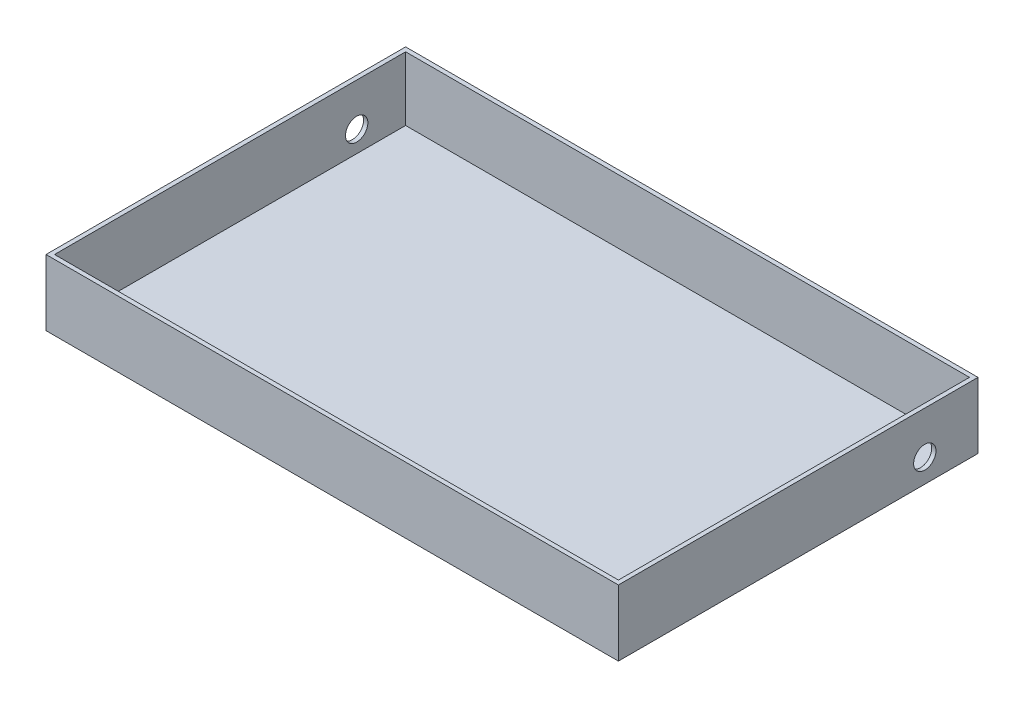
ISO-10303-21;
HEADER;
FILE_DESCRIPTION(('STEP AP214'),'2;1');
FILE_NAME('part.step','',(''),(''),'','','');
FILE_SCHEMA(('AUTOMOTIVE_DESIGN { 1 0 10303 214 1 1 1 1 }'));
ENDSEC;
DATA;
#1=APPLICATION_CONTEXT('core data for automotive mechanical design processes');
#2=APPLICATION_PROTOCOL_DEFINITION('international standard','automotive_design',2000,#1);
#3=PRODUCT_CONTEXT('',#1,'mechanical');
#4=PRODUCT('Part','Part','',(#3));
#5=PRODUCT_RELATED_PRODUCT_CATEGORY('part','',(#4));
#6=PRODUCT_DEFINITION_FORMATION('','',#4);
#7=PRODUCT_DEFINITION_CONTEXT('part definition',#1,'design');
#8=PRODUCT_DEFINITION('design','',#6,#7);
#9=PRODUCT_DEFINITION_SHAPE('','',#8);
#10=(LENGTH_UNIT() NAMED_UNIT(*) SI_UNIT(.MILLI.,.METRE.));
#11=(NAMED_UNIT(*) PLANE_ANGLE_UNIT() SI_UNIT($,.RADIAN.));
#12=(NAMED_UNIT(*) SI_UNIT($,.STERADIAN.) SOLID_ANGLE_UNIT());
#13=UNCERTAINTY_MEASURE_WITH_UNIT(LENGTH_MEASURE(1.E-05),#10,'distance_accuracy_value','');
#14=(GEOMETRIC_REPRESENTATION_CONTEXT(3) GLOBAL_UNCERTAINTY_ASSIGNED_CONTEXT((#13)) GLOBAL_UNIT_ASSIGNED_CONTEXT((#10,
#11,#12)) REPRESENTATION_CONTEXT('',''));
#15=CARTESIAN_POINT('',(0.,0.,0.));
#16=DIRECTION('',(0.,0.,1.));
#17=DIRECTION('',(1.,0.,0.));
#18=AXIS2_PLACEMENT_3D('',#15,#16,#17);
#19=CARTESIAN_POINT('',(0.,30.,0.));
#20=DIRECTION('',(0.,1.,0.));
#21=DIRECTION('',(0.,0.,1.));
#22=AXIS2_PLACEMENT_3D('',#19,#20,#21);
#23=PLANE('',#22);
#24=DIRECTION('',(0.,0.,1.));
#25=VECTOR('',#24,1.);
#26=CARTESIAN_POINT('',(-70.4938729141216,30.,-48.7957647058824));
#27=LINE('',#26,#25);
#28=CARTESIAN_POINT('',(-70.4938729141216,30.,-48.7957647058824));
#29=VERTEX_POINT('',#28);
#30=CARTESIAN_POINT('',(-70.4938729141216,30.,120.204235294118));
#31=VERTEX_POINT('',#30);
#32=EDGE_CURVE('E165',#29,#31,#27,.T.);
#33=ORIENTED_EDGE('',*,*,#32,.T.);
#34=DIRECTION('',(1.,0.,0.));
#35=VECTOR('',#34,1.);
#36=CARTESIAN_POINT('',(-70.4938729141216,30.,120.204235294118));
#37=LINE('',#36,#35);
#38=CARTESIAN_POINT('',(198.506127085878,30.,120.204235294118));
#39=VERTEX_POINT('',#38);
#40=EDGE_CURVE('E167',#31,#39,#37,.T.);
#41=ORIENTED_EDGE('',*,*,#40,.T.);
#42=DIRECTION('',(0.,0.,-1.));
#43=VECTOR('',#42,1.);
#44=CARTESIAN_POINT('',(198.506127085878,30.,-48.7957647058824));
#45=LINE('',#44,#43);
#46=CARTESIAN_POINT('',(198.506127085878,30.,-48.7957647058824));
#47=VERTEX_POINT('',#46);
#48=EDGE_CURVE('E169',#39,#47,#45,.T.);
#49=ORIENTED_EDGE('',*,*,#48,.T.);
#50=DIRECTION('',(-1.,0.,0.));
#51=VECTOR('',#50,1.);
#52=CARTESIAN_POINT('',(-70.4938729141216,30.,-48.7957647058824));
#53=LINE('',#52,#51);
#54=EDGE_CURVE('E63',#47,#29,#53,.T.);
#55=ORIENTED_EDGE('',*,*,#54,.T.);
#56=EDGE_LOOP('',(#33,#41,#49,#55));
#57=FACE_BOUND('',#56,.T.);
#58=DIRECTION('',(1.,0.,0.));
#59=VECTOR('',#58,1.);
#60=CARTESIAN_POINT('',(-68.4938729141216,30.,118.204235294118));
#61=LINE('',#60,#59);
#62=CARTESIAN_POINT('',(-68.4938729141216,30.,118.204235294118));
#63=VERTEX_POINT('',#62);
#64=CARTESIAN_POINT('',(196.506127085878,30.,118.204235294118));
#65=VERTEX_POINT('',#64);
#66=EDGE_CURVE('E140',#63,#65,#61,.T.);
#67=ORIENTED_EDGE('',*,*,#66,.F.);
#68=DIRECTION('',(0.,0.,1.));
#69=VECTOR('',#68,1.);
#70=CARTESIAN_POINT('',(-68.4938729141216,30.,-46.7957647058824));
#71=LINE('',#70,#69);
#72=CARTESIAN_POINT('',(-68.4938729141216,30.,-46.7957647058824));
#73=VERTEX_POINT('',#72);
#74=EDGE_CURVE('E138',#73,#63,#71,.T.);
#75=ORIENTED_EDGE('',*,*,#74,.F.);
#76=DIRECTION('',(-1.,0.,0.));
#77=VECTOR('',#76,1.);
#78=CARTESIAN_POINT('',(-68.4938729141216,30.,-46.7957647058824));
#79=LINE('',#78,#77);
#80=CARTESIAN_POINT('',(196.506127085878,30.,-46.7957647058824));
#81=VERTEX_POINT('',#80);
#82=EDGE_CURVE('E145',#81,#73,#79,.T.);
#83=ORIENTED_EDGE('',*,*,#82,.F.);
#84=DIRECTION('',(0.,0.,-1.));
#85=VECTOR('',#84,1.);
#86=CARTESIAN_POINT('',(196.506127085878,30.,-46.7957647058824));
#87=LINE('',#86,#85);
#88=EDGE_CURVE('E143',#65,#81,#87,.T.);
#89=ORIENTED_EDGE('',*,*,#88,.F.);
#90=EDGE_LOOP('',(#67,#75,#83,#89));
#91=FACE_BOUND('',#90,.T.);
#92=ADVANCED_FACE('F38',(#57,#91),#23,.T.);
#93=CARTESIAN_POINT('',(-70.4938729141216,30.,-48.7957647058824));
#94=DIRECTION('',(1.,0.,0.));
#95=DIRECTION('',(0.,0.,-1.));
#96=AXIS2_PLACEMENT_3D('',#93,#94,#95);
#97=PLANE('',#96);
#98=CARTESIAN_POINT('',(-70.4938729141216,10.,-23.7957647058823));
#99=DIRECTION('',(-1.,0.,0.));
#100=DIRECTION('',(0.,0.,1.));
#101=AXIS2_PLACEMENT_3D('',#98,#99,#100);
#102=CIRCLE('',#101,5.25);
#103=CARTESIAN_POINT('',(-70.4938729141216,10.,-18.5457647058823));
#104=VERTEX_POINT('',#103);
#105=EDGE_CURVE('E176',#104,#104,#102,.T.);
#106=ORIENTED_EDGE('',*,*,#105,.F.);
#107=EDGE_LOOP('',(#106));
#108=FACE_BOUND('',#107,.T.);
#109=DIRECTION('',(0.,-1.,0.));
#110=VECTOR('',#109,1.);
#111=CARTESIAN_POINT('',(-70.4938729141216,30.,-48.7957647058824));
#112=LINE('',#111,#110);
#113=CARTESIAN_POINT('',(-70.4938729141216,-1.,-48.7957647058824));
#114=VERTEX_POINT('',#113);
#115=EDGE_CURVE('E113',#29,#114,#112,.T.);
#116=ORIENTED_EDGE('',*,*,#115,.T.);
#117=DIRECTION('',(0.,0.,1.));
#118=VECTOR('',#117,1.);
#119=CARTESIAN_POINT('',(-70.4938729141216,-1.,0.));
#120=LINE('',#119,#118);
#121=CARTESIAN_POINT('',(-70.4938729141216,-1.,120.204235294118));
#122=VERTEX_POINT('',#121);
#123=EDGE_CURVE('E122',#114,#122,#120,.T.);
#124=ORIENTED_EDGE('',*,*,#123,.T.);
#125=DIRECTION('',(0.,-1.,0.));
#126=VECTOR('',#125,1.);
#127=CARTESIAN_POINT('',(-70.4938729141216,30.,120.204235294118));
#128=LINE('',#127,#126);
#129=EDGE_CURVE('E11',#31,#122,#128,.T.);
#130=ORIENTED_EDGE('',*,*,#129,.F.);
#131=ORIENTED_EDGE('',*,*,#32,.F.);
#132=EDGE_LOOP('',(#116,#124,#130,#131));
#133=FACE_BOUND('',#132,.T.);
#134=ADVANCED_FACE('F40',(#108,#133),#97,.F.);
#135=CARTESIAN_POINT('',(-70.4938729141216,30.,120.204235294118));
#136=DIRECTION('',(0.,0.,-1.));
#137=DIRECTION('',(-1.,0.,0.));
#138=AXIS2_PLACEMENT_3D('',#135,#136,#137);
#139=PLANE('',#138);
#140=ORIENTED_EDGE('',*,*,#129,.T.);
#141=DIRECTION('',(1.,0.,0.));
#142=VECTOR('',#141,1.);
#143=CARTESIAN_POINT('',(0.,-1.,120.204235294118));
#144=LINE('',#143,#142);
#145=CARTESIAN_POINT('',(198.506127085878,-1.,120.204235294118));
#146=VERTEX_POINT('',#145);
#147=EDGE_CURVE('E135',#122,#146,#144,.T.);
#148=ORIENTED_EDGE('',*,*,#147,.T.);
#149=DIRECTION('',(0.,-1.,0.));
#150=VECTOR('',#149,1.);
#151=CARTESIAN_POINT('',(198.506127085878,30.,120.204235294118));
#152=LINE('',#151,#150);
#153=EDGE_CURVE('E47',#39,#146,#152,.T.);
#154=ORIENTED_EDGE('',*,*,#153,.F.);
#155=ORIENTED_EDGE('',*,*,#40,.F.);
#156=EDGE_LOOP('',(#140,#148,#154,#155));
#157=FACE_BOUND('',#156,.T.);
#158=ADVANCED_FACE('F197',(#157),#139,.F.);
#159=CARTESIAN_POINT('',(198.506127085878,30.,-48.7957647058824));
#160=DIRECTION('',(-1.,0.,0.));
#161=DIRECTION('',(0.,0.,1.));
#162=AXIS2_PLACEMENT_3D('',#159,#160,#161);
#163=PLANE('',#162);
#164=CARTESIAN_POINT('',(198.506127085878,10.,-23.7957647058824));
#165=DIRECTION('',(1.,0.,0.));
#166=DIRECTION('',(0.,0.,-1.));
#167=AXIS2_PLACEMENT_3D('',#164,#165,#166);
#168=CIRCLE('',#167,5.25);
#169=CARTESIAN_POINT('',(198.506127085878,10.,-29.0457647058824));
#170=VERTEX_POINT('',#169);
#171=EDGE_CURVE('E129',#170,#170,#168,.T.);
#172=ORIENTED_EDGE('',*,*,#171,.F.);
#173=EDGE_LOOP('',(#172));
#174=FACE_BOUND('',#173,.T.);
#175=ORIENTED_EDGE('',*,*,#153,.T.);
#176=DIRECTION('',(0.,0.,1.));
#177=VECTOR('',#176,1.);
#178=CARTESIAN_POINT('',(198.506127085878,-1.,0.));
#179=LINE('',#178,#177);
#180=CARTESIAN_POINT('',(198.506127085878,-1.,-48.7957647058824));
#181=VERTEX_POINT('',#180);
#182=EDGE_CURVE('E119',#181,#146,#179,.T.);
#183=ORIENTED_EDGE('',*,*,#182,.F.);
#184=DIRECTION('',(0.,-1.,0.));
#185=VECTOR('',#184,1.);
#186=CARTESIAN_POINT('',(198.506127085878,30.,-48.7957647058824));
#187=LINE('',#186,#185);
#188=EDGE_CURVE('E105',#47,#181,#187,.T.);
#189=ORIENTED_EDGE('',*,*,#188,.F.);
#190=ORIENTED_EDGE('',*,*,#48,.F.);
#191=EDGE_LOOP('',(#175,#183,#189,#190));
#192=FACE_BOUND('',#191,.T.);
#193=ADVANCED_FACE('F124',(#174,#192),#163,.F.);
#194=CARTESIAN_POINT('',(-70.4938729141216,30.,-48.7957647058824));
#195=DIRECTION('',(0.,0.,1.));
#196=DIRECTION('',(1.,0.,0.));
#197=AXIS2_PLACEMENT_3D('',#194,#195,#196);
#198=PLANE('',#197);
#199=ORIENTED_EDGE('',*,*,#188,.T.);
#200=DIRECTION('',(1.,0.,0.));
#201=VECTOR('',#200,1.);
#202=CARTESIAN_POINT('',(0.,-1.,-48.7957647058824));
#203=LINE('',#202,#201);
#204=EDGE_CURVE('E108',#114,#181,#203,.T.);
#205=ORIENTED_EDGE('',*,*,#204,.F.);
#206=ORIENTED_EDGE('',*,*,#115,.F.);
#207=ORIENTED_EDGE('',*,*,#54,.F.);
#208=EDGE_LOOP('',(#199,#205,#206,#207));
#209=FACE_BOUND('',#208,.T.);
#210=ADVANCED_FACE('F107',(#209),#198,.F.);
#211=CARTESIAN_POINT('',(-68.4938729141216,30.,-46.7957647058824));
#212=DIRECTION('',(1.,0.,0.));
#213=DIRECTION('',(0.,0.,-1.));
#214=AXIS2_PLACEMENT_3D('',#211,#212,#213);
#215=PLANE('',#214);
#216=CARTESIAN_POINT('',(-68.4938729141216,10.,-23.7957647058823));
#217=DIRECTION('',(1.,0.,0.));
#218=DIRECTION('',(0.,0.,-1.));
#219=AXIS2_PLACEMENT_3D('',#216,#217,#218);
#220=CIRCLE('',#219,5.25);
#221=CARTESIAN_POINT('',(-68.4938729141216,10.,-29.0457647058824));
#222=VERTEX_POINT('',#221);
#223=EDGE_CURVE('E174',#222,#222,#220,.T.);
#224=ORIENTED_EDGE('',*,*,#223,.F.);
#225=EDGE_LOOP('',(#224));
#226=FACE_BOUND('',#225,.T.);
#227=DIRECTION('',(0.,0.,1.));
#228=VECTOR('',#227,1.);
#229=CARTESIAN_POINT('',(-68.4938729141216,0.,-46.7957647058824));
#230=LINE('',#229,#228);
#231=CARTESIAN_POINT('',(-68.4938729141216,0.,-46.7957647058824));
#232=VERTEX_POINT('',#231);
#233=CARTESIAN_POINT('',(-68.4938729141216,0.,118.204235294118));
#234=VERTEX_POINT('',#233);
#235=EDGE_CURVE('E137',#232,#234,#230,.T.);
#236=ORIENTED_EDGE('',*,*,#235,.F.);
#237=DIRECTION('',(0.,-1.,0.));
#238=VECTOR('',#237,1.);
#239=CARTESIAN_POINT('',(-68.4938729141216,30.,-46.7957647058824));
#240=LINE('',#239,#238);
#241=EDGE_CURVE('E147',#73,#232,#240,.T.);
#242=ORIENTED_EDGE('',*,*,#241,.F.);
#243=ORIENTED_EDGE('',*,*,#74,.T.);
#244=DIRECTION('',(0.,-1.,0.));
#245=VECTOR('',#244,1.);
#246=CARTESIAN_POINT('',(-68.4938729141216,30.,118.204235294118));
#247=LINE('',#246,#245);
#248=EDGE_CURVE('E162',#63,#234,#247,.T.);
#249=ORIENTED_EDGE('',*,*,#248,.T.);
#250=EDGE_LOOP('',(#236,#242,#243,#249));
#251=FACE_BOUND('',#250,.T.);
#252=ADVANCED_FACE('F214',(#226,#251),#215,.T.);
#253=CARTESIAN_POINT('',(-68.4938729141216,30.,118.204235294118));
#254=DIRECTION('',(0.,0.,-1.));
#255=DIRECTION('',(-1.,0.,0.));
#256=AXIS2_PLACEMENT_3D('',#253,#254,#255);
#257=PLANE('',#256);
#258=DIRECTION('',(1.,0.,0.));
#259=VECTOR('',#258,1.);
#260=CARTESIAN_POINT('',(-68.4938729141216,0.,118.204235294118));
#261=LINE('',#260,#259);
#262=CARTESIAN_POINT('',(196.506127085878,0.,118.204235294118));
#263=VERTEX_POINT('',#262);
#264=EDGE_CURVE('E150',#234,#263,#261,.T.);
#265=ORIENTED_EDGE('',*,*,#264,.F.);
#266=ORIENTED_EDGE('',*,*,#248,.F.);
#267=ORIENTED_EDGE('',*,*,#66,.T.);
#268=DIRECTION('',(0.,-1.,0.));
#269=VECTOR('',#268,1.);
#270=CARTESIAN_POINT('',(196.506127085878,30.,118.204235294118));
#271=LINE('',#270,#269);
#272=EDGE_CURVE('E160',#65,#263,#271,.T.);
#273=ORIENTED_EDGE('',*,*,#272,.T.);
#274=EDGE_LOOP('',(#265,#266,#267,#273));
#275=FACE_BOUND('',#274,.T.);
#276=ADVANCED_FACE('F220',(#275),#257,.T.);
#277=CARTESIAN_POINT('',(196.506127085878,30.,-46.7957647058824));
#278=DIRECTION('',(-1.,0.,0.));
#279=DIRECTION('',(0.,0.,1.));
#280=AXIS2_PLACEMENT_3D('',#277,#278,#279);
#281=PLANE('',#280);
#282=CARTESIAN_POINT('',(196.506127085878,10.,-23.7957647058824));
#283=DIRECTION('',(-1.,0.,0.));
#284=DIRECTION('',(0.,0.,1.));
#285=AXIS2_PLACEMENT_3D('',#282,#283,#284);
#286=CIRCLE('',#285,5.25);
#287=CARTESIAN_POINT('',(196.506127085878,10.,-18.5457647058824));
#288=VERTEX_POINT('',#287);
#289=EDGE_CURVE('E126',#288,#288,#286,.T.);
#290=ORIENTED_EDGE('',*,*,#289,.F.);
#291=EDGE_LOOP('',(#290));
#292=FACE_BOUND('',#291,.T.);
#293=DIRECTION('',(0.,0.,-1.));
#294=VECTOR('',#293,1.);
#295=CARTESIAN_POINT('',(196.506127085878,0.,-46.7957647058824));
#296=LINE('',#295,#294);
#297=CARTESIAN_POINT('',(196.506127085878,0.,-46.7957647058824));
#298=VERTEX_POINT('',#297);
#299=EDGE_CURVE('E153',#263,#298,#296,.T.);
#300=ORIENTED_EDGE('',*,*,#299,.F.);
#301=ORIENTED_EDGE('',*,*,#272,.F.);
#302=ORIENTED_EDGE('',*,*,#88,.T.);
#303=DIRECTION('',(0.,-1.,0.));
#304=VECTOR('',#303,1.);
#305=CARTESIAN_POINT('',(196.506127085878,30.,-46.7957647058824));
#306=LINE('',#305,#304);
#307=EDGE_CURVE('E55',#81,#298,#306,.T.);
#308=ORIENTED_EDGE('',*,*,#307,.T.);
#309=EDGE_LOOP('',(#300,#301,#302,#308));
#310=FACE_BOUND('',#309,.T.);
#311=ADVANCED_FACE('F225',(#292,#310),#281,.T.);
#312=CARTESIAN_POINT('',(-68.4938729141216,30.,-46.7957647058824));
#313=DIRECTION('',(0.,0.,1.));
#314=DIRECTION('',(1.,0.,0.));
#315=AXIS2_PLACEMENT_3D('',#312,#313,#314);
#316=PLANE('',#315);
#317=DIRECTION('',(-1.,0.,0.));
#318=VECTOR('',#317,1.);
#319=CARTESIAN_POINT('',(-68.4938729141216,0.,-46.7957647058824));
#320=LINE('',#319,#318);
#321=EDGE_CURVE('E141',#298,#232,#320,.T.);
#322=ORIENTED_EDGE('',*,*,#321,.F.);
#323=ORIENTED_EDGE('',*,*,#307,.F.);
#324=ORIENTED_EDGE('',*,*,#82,.T.);
#325=ORIENTED_EDGE('',*,*,#241,.T.);
#326=EDGE_LOOP('',(#322,#323,#324,#325));
#327=FACE_BOUND('',#326,.T.);
#328=ADVANCED_FACE('F236',(#327),#316,.T.);
#329=CARTESIAN_POINT('',(0.,0.,0.));
#330=DIRECTION('',(0.,1.,0.));
#331=DIRECTION('',(0.,0.,1.));
#332=AXIS2_PLACEMENT_3D('',#329,#330,#331);
#333=PLANE('',#332);
#334=CARTESIAN_POINT('',(-45.4938729141216,0.,95.2042352941177));
#335=DIRECTION('',(0.,1.,0.));
#336=DIRECTION('',(0.,0.,1.));
#337=AXIS2_PLACEMENT_3D('',#334,#335,#336);
#338=CIRCLE('',#337,3.35000000000001);
#339=CARTESIAN_POINT('',(-45.4938729141216,0.,98.5542352941177));
#340=VERTEX_POINT('',#339);
#341=EDGE_CURVE('E179',#340,#340,#338,.T.);
#342=ORIENTED_EDGE('',*,*,#341,.F.);
#343=EDGE_LOOP('',(#342));
#344=FACE_BOUND('',#343,.T.);
#345=CARTESIAN_POINT('',(173.506127085878,0.,95.2042352941177));
#346=DIRECTION('',(0.,1.,0.));
#347=DIRECTION('',(0.,0.,-1.));
#348=AXIS2_PLACEMENT_3D('',#345,#346,#347);
#349=CIRCLE('',#348,3.35);
#350=CARTESIAN_POINT('',(173.506127085878,0.,91.8542352941177));
#351=VERTEX_POINT('',#350);
#352=EDGE_CURVE('E184',#351,#351,#349,.T.);
#353=ORIENTED_EDGE('',*,*,#352,.F.);
#354=EDGE_LOOP('',(#353));
#355=FACE_BOUND('',#354,.T.);
#356=ORIENTED_EDGE('',*,*,#321,.T.);
#357=ORIENTED_EDGE('',*,*,#235,.T.);
#358=ORIENTED_EDGE('',*,*,#264,.T.);
#359=ORIENTED_EDGE('',*,*,#299,.T.);
#360=EDGE_LOOP('',(#356,#357,#358,#359));
#361=FACE_BOUND('',#360,.T.);
#362=ADVANCED_FACE('F234',(#344,#355,#361),#333,.T.);
#363=CARTESIAN_POINT('',(0.,-1.,0.));
#364=DIRECTION('',(0.,1.,0.));
#365=DIRECTION('',(0.,0.,1.));
#366=AXIS2_PLACEMENT_3D('',#363,#364,#365);
#367=PLANE('',#366);
#368=CARTESIAN_POINT('',(-45.4938729141216,-0.999999999999999,95.2042352941177));
#369=DIRECTION('',(0.,1.,0.));
#370=DIRECTION('',(0.,0.,1.));
#371=AXIS2_PLACEMENT_3D('',#368,#369,#370);
#372=CIRCLE('',#371,3.35000000000001);
#373=CARTESIAN_POINT('',(-45.4938729141216,-0.999999999999999,98.5542352941177));
#374=VERTEX_POINT('',#373);
#375=EDGE_CURVE('E42',#374,#374,#372,.T.);
#376=ORIENTED_EDGE('',*,*,#375,.T.);
#377=EDGE_LOOP('',(#376));
#378=FACE_BOUND('',#377,.T.);
#379=CARTESIAN_POINT('',(173.506127085878,-0.999999999999999,95.2042352941177));
#380=DIRECTION('',(0.,1.,0.));
#381=DIRECTION('',(0.,0.,1.));
#382=AXIS2_PLACEMENT_3D('',#379,#380,#381);
#383=CIRCLE('',#382,3.35);
#384=CARTESIAN_POINT('',(173.506127085878,-0.999999999999999,98.5542352941177));
#385=VERTEX_POINT('',#384);
#386=EDGE_CURVE('E177',#385,#385,#383,.T.);
#387=ORIENTED_EDGE('',*,*,#386,.T.);
#388=EDGE_LOOP('',(#387));
#389=FACE_BOUND('',#388,.T.);
#390=ORIENTED_EDGE('',*,*,#182,.T.);
#391=ORIENTED_EDGE('',*,*,#147,.F.);
#392=ORIENTED_EDGE('',*,*,#123,.F.);
#393=ORIENTED_EDGE('',*,*,#204,.T.);
#394=EDGE_LOOP('',(#390,#391,#392,#393));
#395=FACE_BOUND('',#394,.T.);
#396=ADVANCED_FACE('F117',(#378,#389,#395),#367,.F.);
#397=CARTESIAN_POINT('',(188.506127085878,10.,-23.7957647058824));
#398=DIRECTION('',(1.,0.,0.));
#399=DIRECTION('',(0.,0.,-1.));
#400=AXIS2_PLACEMENT_3D('',#397,#398,#399);
#401=CYLINDRICAL_SURFACE('',#400,5.25);
#402=ORIENTED_EDGE('',*,*,#289,.T.);
#403=EDGE_LOOP('',(#402));
#404=FACE_BOUND('',#403,.T.);
#405=ORIENTED_EDGE('',*,*,#171,.T.);
#406=EDGE_LOOP('',(#405));
#407=FACE_BOUND('',#406,.T.);
#408=ADVANCED_FACE('F256',(#404,#407),#401,.F.);
#409=CARTESIAN_POINT('',(-60.4938729141216,10.,-23.7957647058823));
#410=DIRECTION('',(-1.,0.,0.));
#411=DIRECTION('',(0.,0.,1.));
#412=AXIS2_PLACEMENT_3D('',#409,#410,#411);
#413=CYLINDRICAL_SURFACE('',#412,5.25);
#414=ORIENTED_EDGE('',*,*,#223,.T.);
#415=EDGE_LOOP('',(#414));
#416=FACE_BOUND('',#415,.T.);
#417=ORIENTED_EDGE('',*,*,#105,.T.);
#418=EDGE_LOOP('',(#417));
#419=FACE_BOUND('',#418,.T.);
#420=ADVANCED_FACE('F193',(#416,#419),#413,.F.);
#421=CARTESIAN_POINT('',(173.506127085878,-10.,95.2042352941177));
#422=DIRECTION('',(0.,1.,0.));
#423=DIRECTION('',(0.,0.,1.));
#424=AXIS2_PLACEMENT_3D('',#421,#422,#423);
#425=CYLINDRICAL_SURFACE('',#424,3.35);
#426=ORIENTED_EDGE('',*,*,#352,.T.);
#427=EDGE_LOOP('',(#426));
#428=FACE_BOUND('',#427,.T.);
#429=ORIENTED_EDGE('',*,*,#386,.F.);
#430=EDGE_LOOP('',(#429));
#431=FACE_BOUND('',#430,.T.);
#432=ADVANCED_FACE('F263',(#428,#431),#425,.F.);
#433=CARTESIAN_POINT('',(-45.4938729141216,-10.,95.2042352941177));
#434=DIRECTION('',(0.,1.,0.));
#435=DIRECTION('',(0.,0.,1.));
#436=AXIS2_PLACEMENT_3D('',#433,#434,#435);
#437=CYLINDRICAL_SURFACE('',#436,3.35000000000001);
#438=ORIENTED_EDGE('',*,*,#341,.T.);
#439=EDGE_LOOP('',(#438));
#440=FACE_BOUND('',#439,.T.);
#441=ORIENTED_EDGE('',*,*,#375,.F.);
#442=EDGE_LOOP('',(#441));
#443=FACE_BOUND('',#442,.T.);
#444=ADVANCED_FACE('F267',(#440,#443),#437,.F.);
#445=CLOSED_SHELL('',(#92,#134,#158,#193,#210,#252,#276,#311,#328,#362,#396,#408,#420,#432,#444));
#446=MANIFOLD_SOLID_BREP('B2',#445);
#447=ADVANCED_BREP_SHAPE_REPRESENTATION('',(#18,#446),#14);
#448=SHAPE_DEFINITION_REPRESENTATION(#9,#447);
ENDSEC;
END-ISO-10303-21;
